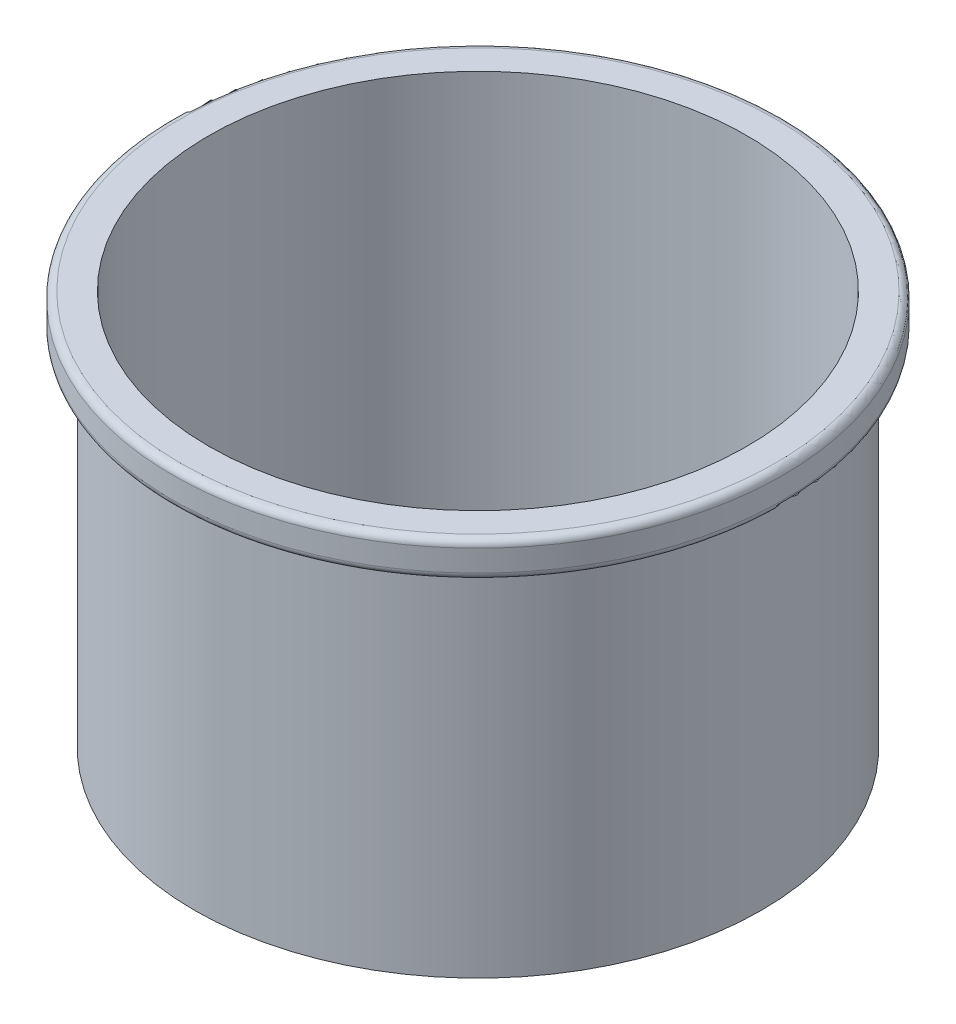
ISO-10303-21;
HEADER;
FILE_DESCRIPTION(('STEP AP214'),'2;1');
FILE_NAME('part.step','',(''),(''),'','','');
FILE_SCHEMA(('AUTOMOTIVE_DESIGN { 1 0 10303 214 1 1 1 1 }'));
ENDSEC;
DATA;
#1=APPLICATION_CONTEXT('core data for automotive mechanical design processes');
#2=APPLICATION_PROTOCOL_DEFINITION('international standard','automotive_design',2000,#1);
#3=PRODUCT_CONTEXT('',#1,'mechanical');
#4=PRODUCT('Part','Part','',(#3));
#5=PRODUCT_RELATED_PRODUCT_CATEGORY('part','',(#4));
#6=PRODUCT_DEFINITION_FORMATION('','',#4);
#7=PRODUCT_DEFINITION_CONTEXT('part definition',#1,'design');
#8=PRODUCT_DEFINITION('design','',#6,#7);
#9=PRODUCT_DEFINITION_SHAPE('','',#8);
#10=(LENGTH_UNIT() NAMED_UNIT(*) SI_UNIT(.MILLI.,.METRE.));
#11=(NAMED_UNIT(*) PLANE_ANGLE_UNIT() SI_UNIT($,.RADIAN.));
#12=(NAMED_UNIT(*) SI_UNIT($,.STERADIAN.) SOLID_ANGLE_UNIT());
#13=UNCERTAINTY_MEASURE_WITH_UNIT(LENGTH_MEASURE(1.E-05),#10,'distance_accuracy_value','');
#14=(GEOMETRIC_REPRESENTATION_CONTEXT(3) GLOBAL_UNCERTAINTY_ASSIGNED_CONTEXT((#13)) GLOBAL_UNIT_ASSIGNED_CONTEXT((#10,
#11,#12)) REPRESENTATION_CONTEXT('',''));
#15=CARTESIAN_POINT('',(0.,0.,0.));
#16=DIRECTION('',(0.,0.,1.));
#17=DIRECTION('',(1.,0.,0.));
#18=AXIS2_PLACEMENT_3D('',#15,#16,#17);
#19=CARTESIAN_POINT('',(0.,110.,0.));
#20=DIRECTION('',(0.,1.,0.));
#21=DIRECTION('',(0.,0.,1.));
#22=AXIS2_PLACEMENT_3D('',#19,#20,#21);
#23=PLANE('',#22);
#24=CARTESIAN_POINT('',(0.,110.,0.));
#25=DIRECTION('',(0.,1.,0.));
#26=DIRECTION('',(0.,0.,1.));
#27=AXIS2_PLACEMENT_3D('',#24,#25,#26);
#28=CIRCLE('',#27,75.);
#29=CARTESIAN_POINT('',(0.,110.,75.));
#30=VERTEX_POINT('',#29);
#31=EDGE_CURVE('E38',#30,#30,#28,.T.);
#32=ORIENTED_EDGE('',*,*,#31,.F.);
#33=EDGE_LOOP('',(#32));
#34=FACE_BOUND('',#33,.T.);
#35=CARTESIAN_POINT('',(0.,110.,0.));
#36=DIRECTION('',(0.,-1.,0.));
#37=DIRECTION('',(0.,0.,-1.));
#38=AXIS2_PLACEMENT_3D('',#35,#36,#37);
#39=CIRCLE('',#38,83.);
#40=CARTESIAN_POINT('',(0.,110.,-83.));
#41=VERTEX_POINT('',#40);
#42=EDGE_CURVE('E46',#41,#41,#39,.T.);
#43=ORIENTED_EDGE('',*,*,#42,.F.);
#44=EDGE_LOOP('',(#43));
#45=FACE_BOUND('',#44,.T.);
#46=ADVANCED_FACE('F31',(#34,#45),#23,.T.);
#47=CARTESIAN_POINT('',(0.,110.,0.));
#48=DIRECTION('',(0.,-1.,0.));
#49=DIRECTION('',(0.,0.,-1.));
#50=AXIS2_PLACEMENT_3D('',#47,#48,#49);
#51=CYLINDRICAL_SURFACE('',#50,75.);
#52=ORIENTED_EDGE('',*,*,#31,.T.);
#53=EDGE_LOOP('',(#52));
#54=FACE_BOUND('',#53,.T.);
#55=CARTESIAN_POINT('',(0.,4.,0.));
#56=DIRECTION('',(0.,1.,0.));
#57=DIRECTION('',(0.,0.,1.));
#58=AXIS2_PLACEMENT_3D('',#55,#56,#57);
#59=CIRCLE('',#58,75.);
#60=CARTESIAN_POINT('',(0.,4.,75.));
#61=VERTEX_POINT('',#60);
#62=EDGE_CURVE('E42',#61,#61,#59,.T.);
#63=ORIENTED_EDGE('',*,*,#62,.F.);
#64=EDGE_LOOP('',(#63));
#65=FACE_BOUND('',#64,.T.);
#66=ADVANCED_FACE('F80',(#54,#65),#51,.F.);
#67=CARTESIAN_POINT('',(0.,4.,0.));
#68=DIRECTION('',(0.,1.,0.));
#69=DIRECTION('',(0.,0.,1.));
#70=AXIS2_PLACEMENT_3D('',#67,#68,#69);
#71=PLANE('',#70);
#72=ORIENTED_EDGE('',*,*,#62,.T.);
#73=EDGE_LOOP('',(#72));
#74=FACE_BOUND('',#73,.T.);
#75=ADVANCED_FACE('F86',(#74),#71,.T.);
#76=CARTESIAN_POINT('',(0.,108.,0.));
#77=DIRECTION('',(0.,-1.,0.));
#78=DIRECTION('',(0.,0.,-1.));
#79=AXIS2_PLACEMENT_3D('',#76,#77,#78);
#80=TOROIDAL_SURFACE('',#79,83.,2.);
#81=ORIENTED_EDGE('',*,*,#42,.T.);
#82=EDGE_LOOP('',(#81));
#83=FACE_BOUND('',#82,.T.);
#84=CARTESIAN_POINT('',(0.,108.,0.));
#85=DIRECTION('',(0.,-1.,0.));
#86=DIRECTION('',(0.,0.,-1.));
#87=AXIS2_PLACEMENT_3D('',#84,#85,#86);
#88=CIRCLE('',#87,85.);
#89=CARTESIAN_POINT('',(0.,108.,-85.));
#90=VERTEX_POINT('',#89);
#91=EDGE_CURVE('E51',#90,#90,#88,.T.);
#92=ORIENTED_EDGE('',*,*,#91,.F.);
#93=EDGE_LOOP('',(#92));
#94=FACE_BOUND('',#93,.T.);
#95=ADVANCED_FACE('F91',(#83,#94),#80,.T.);
#96=CARTESIAN_POINT('',(0.,-5.5,0.));
#97=DIRECTION('',(0.,-1.,0.));
#98=DIRECTION('',(0.,0.,-1.));
#99=AXIS2_PLACEMENT_3D('',#96,#97,#98);
#100=CYLINDRICAL_SURFACE('',#99,85.);
#101=ORIENTED_EDGE('',*,*,#91,.T.);
#102=EDGE_LOOP('',(#101));
#103=FACE_BOUND('',#102,.T.);
#104=CARTESIAN_POINT('',(0.,102.,0.));
#105=DIRECTION('',(0.,-1.,0.));
#106=DIRECTION('',(0.,0.,-1.));
#107=AXIS2_PLACEMENT_3D('',#104,#105,#106);
#108=CIRCLE('',#107,85.);
#109=CARTESIAN_POINT('',(0.,102.,-85.));
#110=VERTEX_POINT('',#109);
#111=EDGE_CURVE('E54',#110,#110,#108,.T.);
#112=ORIENTED_EDGE('',*,*,#111,.F.);
#113=EDGE_LOOP('',(#112));
#114=FACE_BOUND('',#113,.T.);
#115=ADVANCED_FACE('F76',(#103,#114),#100,.T.);
#116=CARTESIAN_POINT('',(0.,102.,0.));
#117=DIRECTION('',(0.,-1.,0.));
#118=DIRECTION('',(0.,0.,-1.));
#119=AXIS2_PLACEMENT_3D('',#116,#117,#118);
#120=TOROIDAL_SURFACE('',#119,83.,2.);
#121=ORIENTED_EDGE('',*,*,#111,.T.);
#122=EDGE_LOOP('',(#121));
#123=FACE_BOUND('',#122,.T.);
#124=CARTESIAN_POINT('',(0.,100.,0.));
#125=DIRECTION('',(0.,-1.,0.));
#126=DIRECTION('',(0.,0.,-1.));
#127=AXIS2_PLACEMENT_3D('',#124,#125,#126);
#128=CIRCLE('',#127,83.);
#129=CARTESIAN_POINT('',(0.,100.,-83.));
#130=VERTEX_POINT('',#129);
#131=EDGE_CURVE('E57',#130,#130,#128,.T.);
#132=ORIENTED_EDGE('',*,*,#131,.F.);
#133=EDGE_LOOP('',(#132));
#134=FACE_BOUND('',#133,.T.);
#135=ADVANCED_FACE('F68',(#123,#134),#120,.T.);
#136=CARTESIAN_POINT('',(0.,100.,-83.));
#137=DIRECTION('',(0.,-1.,0.));
#138=DIRECTION('',(0.,0.,-1.));
#139=AXIS2_PLACEMENT_3D('',#136,#137,#138);
#140=PLANE('',#139);
#141=ORIENTED_EDGE('',*,*,#131,.T.);
#142=EDGE_LOOP('',(#141));
#143=FACE_BOUND('',#142,.T.);
#144=CARTESIAN_POINT('',(0.,100.,0.));
#145=DIRECTION('',(0.,-1.,0.));
#146=DIRECTION('',(0.,0.,-1.));
#147=AXIS2_PLACEMENT_3D('',#144,#145,#146);
#148=CIRCLE('',#147,79.);
#149=CARTESIAN_POINT('',(0.,100.,-79.));
#150=VERTEX_POINT('',#149);
#151=EDGE_CURVE('E60',#150,#150,#148,.T.);
#152=ORIENTED_EDGE('',*,*,#151,.F.);
#153=EDGE_LOOP('',(#152));
#154=FACE_BOUND('',#153,.T.);
#155=ADVANCED_FACE('F65',(#143,#154),#140,.T.);
#156=CARTESIAN_POINT('',(0.,0.,0.));
#157=DIRECTION('',(0.,1.,0.));
#158=DIRECTION('',(0.,0.,1.));
#159=AXIS2_PLACEMENT_3D('',#156,#157,#158);
#160=PLANE('',#159);
#161=CARTESIAN_POINT('',(0.,0.,0.));
#162=DIRECTION('',(0.,1.,0.));
#163=DIRECTION('',(0.,0.,1.));
#164=AXIS2_PLACEMENT_3D('',#161,#162,#163);
#165=CIRCLE('',#164,79.);
#166=CARTESIAN_POINT('',(0.,0.,79.));
#167=VERTEX_POINT('',#166);
#168=EDGE_CURVE('E10',#167,#167,#165,.T.);
#169=ORIENTED_EDGE('',*,*,#168,.F.);
#170=EDGE_LOOP('',(#169));
#171=FACE_BOUND('',#170,.T.);
#172=ADVANCED_FACE('F67',(#171),#160,.F.);
#173=CARTESIAN_POINT('',(0.,110.,0.));
#174=DIRECTION('',(0.,-1.,0.));
#175=DIRECTION('',(0.,0.,-1.));
#176=AXIS2_PLACEMENT_3D('',#173,#174,#175);
#177=CYLINDRICAL_SURFACE('',#176,79.);
#178=ORIENTED_EDGE('',*,*,#151,.T.);
#179=EDGE_LOOP('',(#178));
#180=FACE_BOUND('',#179,.T.);
#181=ORIENTED_EDGE('',*,*,#168,.T.);
#182=EDGE_LOOP('',(#181));
#183=FACE_BOUND('',#182,.T.);
#184=ADVANCED_FACE('F33',(#180,#183),#177,.T.);
#185=CLOSED_SHELL('',(#46,#66,#75,#95,#115,#135,#155,#172,#184));
#186=MANIFOLD_SOLID_BREP('B2',#185);
#187=ADVANCED_BREP_SHAPE_REPRESENTATION('',(#18,#186),#14);
#188=SHAPE_DEFINITION_REPRESENTATION(#9,#187);
ENDSEC;
END-ISO-10303-21;
